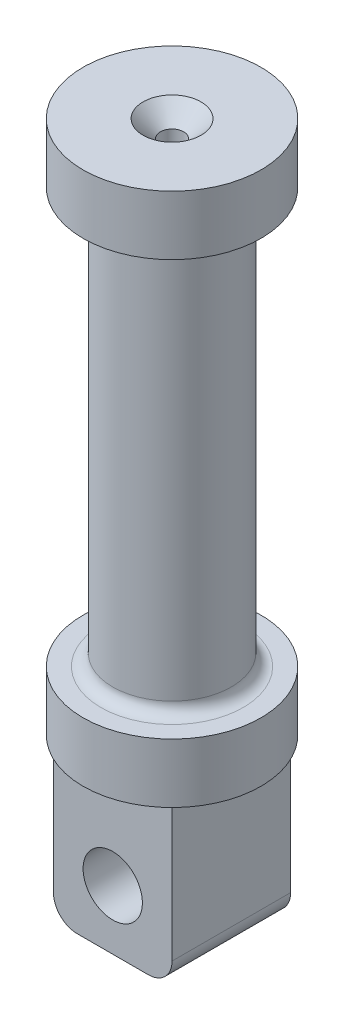
ISO-10303-21;
HEADER;
FILE_DESCRIPTION(('STEP AP214'),'2;1');
FILE_NAME('part.step','',(''),(''),'','','');
FILE_SCHEMA(('AUTOMOTIVE_DESIGN { 1 0 10303 214 1 1 1 1 }'));
ENDSEC;
DATA;
#1=APPLICATION_CONTEXT('core data for automotive mechanical design processes');
#2=APPLICATION_PROTOCOL_DEFINITION('international standard','automotive_design',2000,#1);
#3=PRODUCT_CONTEXT('',#1,'mechanical');
#4=PRODUCT('Part','Part','',(#3));
#5=PRODUCT_RELATED_PRODUCT_CATEGORY('part','',(#4));
#6=PRODUCT_DEFINITION_FORMATION('','',#4);
#7=PRODUCT_DEFINITION_CONTEXT('part definition',#1,'design');
#8=PRODUCT_DEFINITION('design','',#6,#7);
#9=PRODUCT_DEFINITION_SHAPE('','',#8);
#10=(LENGTH_UNIT() NAMED_UNIT(*) SI_UNIT(.MILLI.,.METRE.));
#11=(NAMED_UNIT(*) PLANE_ANGLE_UNIT() SI_UNIT($,.RADIAN.));
#12=(NAMED_UNIT(*) SI_UNIT($,.STERADIAN.) SOLID_ANGLE_UNIT());
#13=UNCERTAINTY_MEASURE_WITH_UNIT(LENGTH_MEASURE(1.E-05),#10,'distance_accuracy_value','');
#14=(GEOMETRIC_REPRESENTATION_CONTEXT(3) GLOBAL_UNCERTAINTY_ASSIGNED_CONTEXT((#13)) GLOBAL_UNIT_ASSIGNED_CONTEXT((#10,
#11,#12)) REPRESENTATION_CONTEXT('',''));
#15=CARTESIAN_POINT('',(0.,0.,0.));
#16=DIRECTION('',(0.,0.,1.));
#17=DIRECTION('',(1.,0.,0.));
#18=AXIS2_PLACEMENT_3D('',#15,#16,#17);
#19=CARTESIAN_POINT('',(1053.1485327014,994.646701933444,1037.31529061443));
#20=DIRECTION('',(-1.,0.,0.));
#21=DIRECTION('',(0.,0.,1.));
#22=AXIS2_PLACEMENT_3D('',#19,#20,#21);
#23=PLANE('',#22);
#24=DIRECTION('',(0.,-1.,0.));
#25=VECTOR('',#24,1.);
#26=CARTESIAN_POINT('',(1053.1485327014,994.646701933444,1050.01529061443));
#27=LINE('',#26,#25);
#28=CARTESIAN_POINT('',(1053.1485327014,994.646701933444,1050.01529061443));
#29=VERTEX_POINT('',#28);
#30=CARTESIAN_POINT('',(1053.1485327014,965.409729673444,1050.01529061443));
#31=VERTEX_POINT('',#30);
#32=EDGE_CURVE('P0_E116',#29,#31,#27,.T.);
#33=ORIENTED_EDGE('',*,*,#32,.T.);
#34=DIRECTION('',(0.,0.,-1.));
#35=VECTOR('',#34,1.);
#36=CARTESIAN_POINT('',(1053.1485327014,965.409729673444,1037.31529061443));
#37=LINE('',#36,#35);
#38=CARTESIAN_POINT('',(1053.1485327014,965.409729673444,1024.61529061443));
#39=VERTEX_POINT('',#38);
#40=EDGE_CURVE('P0_E131',#31,#39,#37,.T.);
#41=ORIENTED_EDGE('',*,*,#40,.T.);
#42=DIRECTION('',(0.,-1.,0.));
#43=VECTOR('',#42,1.);
#44=CARTESIAN_POINT('',(1053.1485327014,994.646701933444,1024.61529061443));
#45=LINE('',#44,#43);
#46=CARTESIAN_POINT('',(1053.1485327014,994.646701933444,1024.61529061443));
#47=VERTEX_POINT('',#46);
#48=EDGE_CURVE('P0_E128',#47,#39,#45,.T.);
#49=ORIENTED_EDGE('',*,*,#48,.F.);
#50=DIRECTION('',(0.,0.,-1.));
#51=VECTOR('',#50,1.);
#52=CARTESIAN_POINT('',(1053.1485327014,994.646701933444,1050.01529061443));
#53=LINE('',#52,#51);
#54=EDGE_CURVE('P0_E103',#29,#47,#53,.T.);
#55=ORIENTED_EDGE('',*,*,#54,.F.);
#56=EDGE_LOOP('',(#33,#41,#49,#55));
#57=FACE_BOUND('',#56,.T.);
#58=ADVANCED_FACE('P0_F16',(#57),#23,.F.);
#59=CARTESIAN_POINT('',(1040.4485327014,994.646701933444,1024.61529061443));
#60=DIRECTION('',(0.,0.,1.));
#61=DIRECTION('',(1.,0.,0.));
#62=AXIS2_PLACEMENT_3D('',#59,#60,#61);
#63=PLANE('',#62);
#64=CARTESIAN_POINT('',(1040.4485327014,973.029729673444,1024.61529061443));
#65=DIRECTION('',(0.,0.,1.));
#66=DIRECTION('',(1.,0.,0.));
#67=AXIS2_PLACEMENT_3D('',#64,#65,#66);
#68=CIRCLE('',#67,6.35);
#69=CARTESIAN_POINT('',(1046.7985327014,973.029729673444,1024.61529061443));
#70=VERTEX_POINT('',#69);
#71=EDGE_CURVE('P0_E86',#70,#70,#68,.T.);
#72=ORIENTED_EDGE('',*,*,#71,.T.);
#73=EDGE_LOOP('',(#72));
#74=FACE_BOUND('',#73,.T.);
#75=ORIENTED_EDGE('',*,*,#48,.T.);
#76=CARTESIAN_POINT('',(1048.0685327014,965.409729673444,1024.61529061443));
#77=DIRECTION('',(0.,0.,1.));
#78=DIRECTION('',(1.,0.,0.));
#79=AXIS2_PLACEMENT_3D('',#76,#77,#78);
#80=CIRCLE('',#79,5.08);
#81=CARTESIAN_POINT('',(1048.0685327014,960.329729673444,1024.61529061443));
#82=VERTEX_POINT('',#81);
#83=EDGE_CURVE('P0_E136',#39,#82,#80,.F.);
#84=ORIENTED_EDGE('',*,*,#83,.T.);
#85=DIRECTION('',(-1.,0.,0.));
#86=VECTOR('',#85,1.);
#87=CARTESIAN_POINT('',(1040.4485327014,960.329729673444,1024.61529061443));
#88=LINE('',#87,#86);
#89=CARTESIAN_POINT('',(1032.8285327014,960.329729673444,1024.61529061443));
#90=VERTEX_POINT('',#89);
#91=EDGE_CURVE('P0_E100',#82,#90,#88,.T.);
#92=ORIENTED_EDGE('',*,*,#91,.T.);
#93=CARTESIAN_POINT('',(1032.8285327014,965.409729673444,1024.61529061443));
#94=DIRECTION('',(0.,0.,1.));
#95=DIRECTION('',(1.,0.,0.));
#96=AXIS2_PLACEMENT_3D('',#93,#94,#95);
#97=CIRCLE('',#96,5.08);
#98=CARTESIAN_POINT('',(1027.7485327014,965.409729673444,1024.61529061443));
#99=VERTEX_POINT('',#98);
#100=EDGE_CURVE('P0_E134',#90,#99,#97,.F.);
#101=ORIENTED_EDGE('',*,*,#100,.T.);
#102=DIRECTION('',(0.,-1.,0.));
#103=VECTOR('',#102,1.);
#104=CARTESIAN_POINT('',(1027.7485327014,994.646701933444,1024.61529061443));
#105=LINE('',#104,#103);
#106=CARTESIAN_POINT('',(1027.7485327014,994.646701933444,1024.61529061443));
#107=VERTEX_POINT('',#106);
#108=EDGE_CURVE('P0_E125',#107,#99,#105,.T.);
#109=ORIENTED_EDGE('',*,*,#108,.F.);
#110=DIRECTION('',(-1.,0.,0.));
#111=VECTOR('',#110,1.);
#112=CARTESIAN_POINT('',(1053.1485327014,994.646701933444,1024.61529061443));
#113=LINE('',#112,#111);
#114=EDGE_CURVE('P0_E106',#47,#107,#113,.T.);
#115=ORIENTED_EDGE('',*,*,#114,.F.);
#116=EDGE_LOOP('',(#75,#84,#92,#101,#109,#115));
#117=FACE_BOUND('',#116,.T.);
#118=ADVANCED_FACE('P0_F161',(#74,#117),#63,.F.);
#119=CARTESIAN_POINT('',(1027.7485327014,994.646701933444,1037.31529061443));
#120=DIRECTION('',(1.,0.,0.));
#121=DIRECTION('',(0.,0.,-1.));
#122=AXIS2_PLACEMENT_3D('',#119,#120,#121);
#123=PLANE('',#122);
#124=ORIENTED_EDGE('',*,*,#108,.T.);
#125=DIRECTION('',(0.,0.,1.));
#126=VECTOR('',#125,1.);
#127=CARTESIAN_POINT('',(1027.7485327014,965.409729673444,1037.31529061443));
#128=LINE('',#127,#126);
#129=CARTESIAN_POINT('',(1027.7485327014,965.409729673444,1050.01529061443));
#130=VERTEX_POINT('',#129);
#131=EDGE_CURVE('P0_E144',#99,#130,#128,.T.);
#132=ORIENTED_EDGE('',*,*,#131,.T.);
#133=DIRECTION('',(0.,-1.,0.));
#134=VECTOR('',#133,1.);
#135=CARTESIAN_POINT('',(1027.7485327014,994.646701933444,1050.01529061443));
#136=LINE('',#135,#134);
#137=CARTESIAN_POINT('',(1027.7485327014,994.646701933444,1050.01529061443));
#138=VERTEX_POINT('',#137);
#139=EDGE_CURVE('P0_E122',#138,#130,#136,.T.);
#140=ORIENTED_EDGE('',*,*,#139,.F.);
#141=DIRECTION('',(0.,0.,1.));
#142=VECTOR('',#141,1.);
#143=CARTESIAN_POINT('',(1027.7485327014,994.646701933444,1024.61529061443));
#144=LINE('',#143,#142);
#145=EDGE_CURVE('P0_E110',#107,#138,#144,.T.);
#146=ORIENTED_EDGE('',*,*,#145,.F.);
#147=EDGE_LOOP('',(#124,#132,#140,#146));
#148=FACE_BOUND('',#147,.T.);
#149=ADVANCED_FACE('P0_F167',(#148),#123,.F.);
#150=CARTESIAN_POINT('',(1040.4485327014,994.646701933444,1050.01529061443));
#151=DIRECTION('',(0.,0.,-1.));
#152=DIRECTION('',(-1.,0.,0.));
#153=AXIS2_PLACEMENT_3D('',#150,#151,#152);
#154=PLANE('',#153);
#155=CARTESIAN_POINT('',(1040.4485327014,973.029729673444,1050.01529061443));
#156=DIRECTION('',(0.,0.,1.));
#157=DIRECTION('',(1.,0.,0.));
#158=AXIS2_PLACEMENT_3D('',#155,#156,#157);
#159=CIRCLE('',#158,6.35);
#160=CARTESIAN_POINT('',(1046.7985327014,973.029729673444,1050.01529061443));
#161=VERTEX_POINT('',#160);
#162=EDGE_CURVE('P0_E82',#161,#161,#159,.T.);
#163=ORIENTED_EDGE('',*,*,#162,.F.);
#164=EDGE_LOOP('',(#163));
#165=FACE_BOUND('',#164,.T.);
#166=DIRECTION('',(1.,0.,0.));
#167=VECTOR('',#166,1.);
#168=CARTESIAN_POINT('',(1040.4485327014,960.329729673444,1050.01529061443));
#169=LINE('',#168,#167);
#170=CARTESIAN_POINT('',(1032.8285327014,960.329729673444,1050.01529061443));
#171=VERTEX_POINT('',#170);
#172=CARTESIAN_POINT('',(1048.0685327014,960.329729673444,1050.01529061443));
#173=VERTEX_POINT('',#172);
#174=EDGE_CURVE('P0_E107',#171,#173,#169,.T.);
#175=ORIENTED_EDGE('',*,*,#174,.T.);
#176=CARTESIAN_POINT('',(1048.0685327014,965.409729673444,1050.01529061443));
#177=DIRECTION('',(0.,0.,-1.));
#178=DIRECTION('',(-1.,0.,0.));
#179=AXIS2_PLACEMENT_3D('',#176,#177,#178);
#180=CIRCLE('',#179,5.08);
#181=EDGE_CURVE('P0_E142',#173,#31,#180,.F.);
#182=ORIENTED_EDGE('',*,*,#181,.T.);
#183=ORIENTED_EDGE('',*,*,#32,.F.);
#184=DIRECTION('',(1.,0.,0.));
#185=VECTOR('',#184,1.);
#186=CARTESIAN_POINT('',(1027.7485327014,994.646701933444,1050.01529061443));
#187=LINE('',#186,#185);
#188=EDGE_CURVE('P0_E113',#138,#29,#187,.T.);
#189=ORIENTED_EDGE('',*,*,#188,.F.);
#190=ORIENTED_EDGE('',*,*,#139,.T.);
#191=CARTESIAN_POINT('',(1032.8285327014,965.409729673444,1050.01529061443));
#192=DIRECTION('',(0.,0.,-1.));
#193=DIRECTION('',(-1.,0.,0.));
#194=AXIS2_PLACEMENT_3D('',#191,#192,#193);
#195=CIRCLE('',#194,5.08);
#196=EDGE_CURVE('P0_E31',#130,#171,#195,.F.);
#197=ORIENTED_EDGE('',*,*,#196,.T.);
#198=EDGE_LOOP('',(#175,#182,#183,#189,#190,#197));
#199=FACE_BOUND('',#198,.T.);
#200=ADVANCED_FACE('P0_F185',(#165,#199),#154,.F.);
#201=CARTESIAN_POINT('',(1040.4485327014,960.329729673444,1037.31529061443));
#202=DIRECTION('',(0.,1.,0.));
#203=DIRECTION('',(0.,0.,1.));
#204=AXIS2_PLACEMENT_3D('',#201,#202,#203);
#205=PLANE('',#204);
#206=ORIENTED_EDGE('',*,*,#91,.F.);
#207=DIRECTION('',(0.,0.,-1.));
#208=VECTOR('',#207,1.);
#209=CARTESIAN_POINT('',(1048.0685327014,960.329729673444,1037.31529061443));
#210=LINE('',#209,#208);
#211=EDGE_CURVE('P0_E39',#82,#173,#210,.F.);
#212=ORIENTED_EDGE('',*,*,#211,.T.);
#213=ORIENTED_EDGE('',*,*,#174,.F.);
#214=DIRECTION('',(0.,0.,1.));
#215=VECTOR('',#214,1.);
#216=CARTESIAN_POINT('',(1032.8285327014,960.329729673444,1037.31529061443));
#217=LINE('',#216,#215);
#218=EDGE_CURVE('P0_E138',#171,#90,#217,.F.);
#219=ORIENTED_EDGE('',*,*,#218,.T.);
#220=EDGE_LOOP('',(#206,#212,#213,#219));
#221=FACE_BOUND('',#220,.T.);
#222=ADVANCED_FACE('P0_F194',(#221),#205,.F.);
#223=CARTESIAN_POINT('',(1040.4485327014,994.646701933444,1037.31529061443));
#224=DIRECTION('',(0.,1.,0.));
#225=DIRECTION('',(0.,0.,1.));
#226=AXIS2_PLACEMENT_3D('',#223,#224,#225);
#227=PLANE('',#226);
#228=CARTESIAN_POINT('',(1040.4485327014,994.646701933444,1037.31529061443));
#229=DIRECTION('',(0.,1.,0.));
#230=DIRECTION('',(0.,0.,1.));
#231=AXIS2_PLACEMENT_3D('',#228,#229,#230);
#232=CIRCLE('',#231,19.05);
#233=CARTESIAN_POINT('',(1040.4485327014,994.646701933444,1056.36529061443));
#234=VERTEX_POINT('',#233);
#235=EDGE_CURVE('P0_E96',#234,#234,#232,.T.);
#236=ORIENTED_EDGE('',*,*,#235,.F.);
#237=EDGE_LOOP('',(#236));
#238=FACE_BOUND('',#237,.T.);
#239=ORIENTED_EDGE('',*,*,#188,.T.);
#240=ORIENTED_EDGE('',*,*,#54,.T.);
#241=ORIENTED_EDGE('',*,*,#114,.T.);
#242=ORIENTED_EDGE('',*,*,#145,.T.);
#243=EDGE_LOOP('',(#239,#240,#241,#242));
#244=FACE_BOUND('',#243,.T.);
#245=ADVANCED_FACE('P0_F189',(#238,#244),#227,.F.);
#246=CARTESIAN_POINT('',(1040.4485327014,1007.34670193344,1037.31529061443));
#247=DIRECTION('',(0.,-1.,0.));
#248=DIRECTION('',(0.,0.,-1.));
#249=AXIS2_PLACEMENT_3D('',#246,#247,#248);
#250=CYLINDRICAL_SURFACE('',#249,19.05);
#251=CARTESIAN_POINT('',(1040.4485327014,1007.34670193344,1037.31529061443));
#252=DIRECTION('',(0.,1.,0.));
#253=DIRECTION('',(0.,0.,1.));
#254=AXIS2_PLACEMENT_3D('',#251,#252,#253);
#255=CIRCLE('',#254,19.05);
#256=CARTESIAN_POINT('',(1040.4485327014,1007.34670193344,1056.36529061443));
#257=VERTEX_POINT('',#256);
#258=EDGE_CURVE('P0_E97',#257,#257,#255,.T.);
#259=ORIENTED_EDGE('',*,*,#258,.F.);
#260=EDGE_LOOP('',(#259));
#261=FACE_BOUND('',#260,.T.);
#262=ORIENTED_EDGE('',*,*,#235,.T.);
#263=EDGE_LOOP('',(#262));
#264=FACE_BOUND('',#263,.T.);
#265=ADVANCED_FACE('P0_F201',(#261,#264),#250,.T.);
#266=CARTESIAN_POINT('',(1040.4485327014,1007.34670193344,1037.31529061443));
#267=DIRECTION('',(0.,1.,0.));
#268=DIRECTION('',(0.,0.,1.));
#269=AXIS2_PLACEMENT_3D('',#266,#267,#268);
#270=PLANE('',#269);
#271=CARTESIAN_POINT('',(1040.4485327014,1007.34670193344,1037.31529061443));
#272=DIRECTION('',(0.,1.,0.));
#273=DIRECTION('',(0.,0.,1.));
#274=AXIS2_PLACEMENT_3D('',#271,#272,#273);
#275=CIRCLE('',#274,15.24);
#276=CARTESIAN_POINT('',(1040.4485327014,1007.34670193344,1052.55529061443));
#277=VERTEX_POINT('',#276);
#278=EDGE_CURVE('P0_E11',#277,#277,#275,.F.);
#279=ORIENTED_EDGE('',*,*,#278,.T.);
#280=EDGE_LOOP('',(#279));
#281=FACE_BOUND('',#280,.T.);
#282=ORIENTED_EDGE('',*,*,#258,.T.);
#283=EDGE_LOOP('',(#282));
#284=FACE_BOUND('',#283,.T.);
#285=ADVANCED_FACE('P0_F243',(#281,#284),#270,.T.);
#286=CARTESIAN_POINT('',(1040.4485327014,1096.24670193344,1037.31529061443));
#287=DIRECTION('',(0.,-1.,0.));
#288=DIRECTION('',(0.,0.,-1.));
#289=AXIS2_PLACEMENT_3D('',#286,#287,#288);
#290=CYLINDRICAL_SURFACE('',#289,12.7);
#291=CARTESIAN_POINT('',(1040.4485327014,1009.88670193344,1037.31529061443));
#292=DIRECTION('',(0.,1.,0.));
#293=DIRECTION('',(0.,0.,1.));
#294=AXIS2_PLACEMENT_3D('',#291,#292,#293);
#295=CIRCLE('',#294,12.7);
#296=CARTESIAN_POINT('',(1040.4485327014,1009.88670193344,1050.01529061443));
#297=VERTEX_POINT('',#296);
#298=EDGE_CURVE('P0_E24',#297,#297,#295,.T.);
#299=ORIENTED_EDGE('',*,*,#298,.T.);
#300=EDGE_LOOP('',(#299));
#301=FACE_BOUND('',#300,.T.);
#302=CARTESIAN_POINT('',(1040.4485327014,1096.24670193344,1037.31529061443));
#303=DIRECTION('',(0.,1.,0.));
#304=DIRECTION('',(0.,0.,1.));
#305=AXIS2_PLACEMENT_3D('',#302,#303,#304);
#306=CIRCLE('',#305,12.7);
#307=CARTESIAN_POINT('',(1040.4485327014,1096.24670193344,1050.01529061443));
#308=VERTEX_POINT('',#307);
#309=EDGE_CURVE('P0_E93',#308,#308,#306,.T.);
#310=ORIENTED_EDGE('',*,*,#309,.F.);
#311=EDGE_LOOP('',(#310));
#312=FACE_BOUND('',#311,.T.);
#313=ADVANCED_FACE('P0_F148',(#301,#312),#290,.T.);
#314=CARTESIAN_POINT('',(1040.4485327014,1096.24670193344,1037.31529061443));
#315=DIRECTION('',(0.,1.,0.));
#316=DIRECTION('',(0.,0.,1.));
#317=AXIS2_PLACEMENT_3D('',#314,#315,#316);
#318=PLANE('',#317);
#319=CARTESIAN_POINT('',(1040.4485327014,1096.24670193344,1037.31529061443));
#320=DIRECTION('',(0.,1.,0.));
#321=DIRECTION('',(0.,0.,1.));
#322=AXIS2_PLACEMENT_3D('',#319,#320,#321);
#323=CIRCLE('',#322,2.49999999999999);
#324=CARTESIAN_POINT('',(1040.4485327014,1096.24670193344,1039.81529061443));
#325=VERTEX_POINT('',#324);
#326=EDGE_CURVE('P0_E83',#325,#325,#323,.T.);
#327=ORIENTED_EDGE('',*,*,#326,.F.);
#328=EDGE_LOOP('',(#327));
#329=FACE_BOUND('',#328,.T.);
#330=ORIENTED_EDGE('',*,*,#309,.T.);
#331=EDGE_LOOP('',(#330));
#332=FACE_BOUND('',#331,.T.);
#333=ADVANCED_FACE('P0_F178',(#329,#332),#318,.T.);
#334=CARTESIAN_POINT('',(1040.4485327014,973.029729673444,1018.26529061443));
#335=DIRECTION('',(0.,0.,1.));
#336=DIRECTION('',(1.,0.,0.));
#337=AXIS2_PLACEMENT_3D('',#334,#335,#336);
#338=CYLINDRICAL_SURFACE('',#337,6.35);
#339=ORIENTED_EDGE('',*,*,#162,.T.);
#340=EDGE_LOOP('',(#339));
#341=FACE_BOUND('',#340,.T.);
#342=ORIENTED_EDGE('',*,*,#71,.F.);
#343=EDGE_LOOP('',(#342));
#344=FACE_BOUND('',#343,.T.);
#345=ADVANCED_FACE('P0_F173',(#341,#344),#338,.F.);
#346=CARTESIAN_POINT('',(1048.0685327014,965.409729673444,1037.31529061443));
#347=DIRECTION('',(0.,0.,-1.));
#348=DIRECTION('',(-1.,0.,0.));
#349=AXIS2_PLACEMENT_3D('',#346,#347,#348);
#350=CYLINDRICAL_SURFACE('',#349,5.08);
#351=ORIENTED_EDGE('',*,*,#181,.F.);
#352=ORIENTED_EDGE('',*,*,#211,.F.);
#353=ORIENTED_EDGE('',*,*,#83,.F.);
#354=ORIENTED_EDGE('',*,*,#40,.F.);
#355=EDGE_LOOP('',(#351,#352,#353,#354));
#356=FACE_BOUND('',#355,.T.);
#357=ADVANCED_FACE('P0_F158',(#356),#350,.T.);
#358=CARTESIAN_POINT('',(1032.8285327014,965.409729673444,1037.31529061443));
#359=DIRECTION('',(0.,0.,1.));
#360=DIRECTION('',(1.,0.,0.));
#361=AXIS2_PLACEMENT_3D('',#358,#359,#360);
#362=CYLINDRICAL_SURFACE('',#361,5.08);
#363=ORIENTED_EDGE('',*,*,#100,.F.);
#364=ORIENTED_EDGE('',*,*,#218,.F.);
#365=ORIENTED_EDGE('',*,*,#196,.F.);
#366=ORIENTED_EDGE('',*,*,#131,.F.);
#367=EDGE_LOOP('',(#363,#364,#365,#366));
#368=FACE_BOUND('',#367,.T.);
#369=ADVANCED_FACE('P0_F152',(#368),#362,.T.);
#370=CARTESIAN_POINT('',(1040.4485327014,1009.88670193344,1037.31529061443));
#371=DIRECTION('',(0.,1.,0.));
#372=DIRECTION('',(0.,0.,1.));
#373=AXIS2_PLACEMENT_3D('',#370,#371,#372);
#374=TOROIDAL_SURFACE('',#373,15.24,2.54);
#375=ORIENTED_EDGE('',*,*,#278,.F.);
#376=EDGE_LOOP('',(#375));
#377=FACE_BOUND('',#376,.T.);
#378=ORIENTED_EDGE('',*,*,#298,.F.);
#379=EDGE_LOOP('',(#378));
#380=FACE_BOUND('',#379,.T.);
#381=ADVANCED_FACE('P0_F18',(#377,#380),#374,.F.);
#382=CARTESIAN_POINT('',(1040.4485327014,1055.09870193344,1037.31529061443));
#383=DIRECTION('',(0.,1.,0.));
#384=DIRECTION('',(0.,0.,1.));
#385=AXIS2_PLACEMENT_3D('',#382,#383,#384);
#386=CONICAL_SURFACE('',#385,2.49999999999999,1.02974425867665);
#387=CARTESIAN_POINT('',(1040.4485327014,1053.59655038587,1037.31529061443));
#388=VERTEX_POINT('',#387);
#389=VERTEX_LOOP('',#388);
#390=FACE_BOUND('',#389,.T.);
#391=CARTESIAN_POINT('',(1040.4485327014,1055.09870193344,1037.31529061443));
#392=DIRECTION('',(0.,1.,0.));
#393=DIRECTION('',(0.,0.,1.));
#394=AXIS2_PLACEMENT_3D('',#391,#392,#393);
#395=CIRCLE('',#394,2.49999999999999);
#396=CARTESIAN_POINT('',(1040.4485327014,1055.09870193344,1039.81529061443));
#397=VERTEX_POINT('',#396);
#398=EDGE_CURVE('P0_E80',#397,#397,#395,.T.);
#399=ORIENTED_EDGE('',*,*,#398,.T.);
#400=EDGE_LOOP('',(#399));
#401=FACE_BOUND('',#400,.T.);
#402=ADVANCED_FACE('P0_F73',(#390,#401),#386,.F.);
#403=CARTESIAN_POINT('',(1040.4485327014,1096.24670193344,1037.31529061443));
#404=DIRECTION('',(0.,1.,0.));
#405=DIRECTION('',(0.,0.,1.));
#406=AXIS2_PLACEMENT_3D('',#403,#404,#405);
#407=CYLINDRICAL_SURFACE('',#406,2.49999999999999);
#408=ORIENTED_EDGE('',*,*,#398,.F.);
#409=EDGE_LOOP('',(#408));
#410=FACE_BOUND('',#409,.T.);
#411=ORIENTED_EDGE('',*,*,#326,.T.);
#412=EDGE_LOOP('',(#411));
#413=FACE_BOUND('',#412,.T.);
#414=ADVANCED_FACE('P0_F76',(#410,#413),#407,.F.);
#415=CLOSED_SHELL('',(#58,#118,#149,#200,#222,#245,#265,#285,#313,#333,#345,#357,#369,#381,#402,#414));
#416=MANIFOLD_SOLID_BREP('P0_B1',#415);
#417=CARTESIAN_POINT('',(1040.4485327014,1108.94670193344,1037.31529061443));
#418=DIRECTION('',(0.,-1.,0.));
#419=DIRECTION('',(0.,0.,-1.));
#420=AXIS2_PLACEMENT_3D('',#417,#418,#419);
#421=CYLINDRICAL_SURFACE('',#420,19.05);
#422=CARTESIAN_POINT('',(1040.4485327014,1108.94670193344,1037.31529061443));
#423=DIRECTION('',(0.,1.,0.));
#424=DIRECTION('',(0.,0.,1.));
#425=AXIS2_PLACEMENT_3D('',#422,#423,#424);
#426=CIRCLE('',#425,19.05);
#427=CARTESIAN_POINT('',(1040.4485327014,1108.94670193344,1056.36529061443));
#428=VERTEX_POINT('',#427);
#429=EDGE_CURVE('P1_E10',#428,#428,#426,.T.);
#430=ORIENTED_EDGE('',*,*,#429,.F.);
#431=EDGE_LOOP('',(#430));
#432=FACE_BOUND('',#431,.T.);
#433=CARTESIAN_POINT('',(1040.4485327014,1096.24670193344,1037.31529061443));
#434=DIRECTION('',(0.,1.,0.));
#435=DIRECTION('',(0.,0.,1.));
#436=AXIS2_PLACEMENT_3D('',#433,#434,#435);
#437=CIRCLE('',#436,19.05);
#438=CARTESIAN_POINT('',(1040.4485327014,1096.24670193344,1056.36529061443));
#439=VERTEX_POINT('',#438);
#440=EDGE_CURVE('P1_E17',#439,#439,#437,.T.);
#441=ORIENTED_EDGE('',*,*,#440,.T.);
#442=EDGE_LOOP('',(#441));
#443=FACE_BOUND('',#442,.T.);
#444=ADVANCED_FACE('P1_F14',(#432,#443),#421,.T.);
#445=CARTESIAN_POINT('',(1040.4485327014,1108.94670193344,1037.31529061443));
#446=DIRECTION('',(0.,1.,0.));
#447=DIRECTION('',(0.,0.,1.));
#448=AXIS2_PLACEMENT_3D('',#445,#446,#447);
#449=PLANE('',#448);
#450=CARTESIAN_POINT('',(1040.4485327014,1108.94670193344,1037.31529061443));
#451=DIRECTION('',(0.,1.,0.));
#452=DIRECTION('',(0.,0.,1.));
#453=AXIS2_PLACEMENT_3D('',#450,#451,#452);
#454=CIRCLE('',#453,6.2);
#455=CARTESIAN_POINT('',(1040.4485327014,1108.94670193344,1043.51529061443));
#456=VERTEX_POINT('',#455);
#457=EDGE_CURVE('P1_E31',#456,#456,#454,.T.);
#458=ORIENTED_EDGE('',*,*,#457,.F.);
#459=EDGE_LOOP('',(#458));
#460=FACE_BOUND('',#459,.T.);
#461=ORIENTED_EDGE('',*,*,#429,.T.);
#462=EDGE_LOOP('',(#461));
#463=FACE_BOUND('',#462,.T.);
#464=ADVANCED_FACE('P1_F37',(#460,#463),#449,.T.);
#465=CARTESIAN_POINT('',(1040.4485327014,1096.24670193344,1037.31529061443));
#466=DIRECTION('',(0.,1.,0.));
#467=DIRECTION('',(0.,0.,1.));
#468=AXIS2_PLACEMENT_3D('',#465,#466,#467);
#469=PLANE('',#468);
#470=CARTESIAN_POINT('',(1040.4485327014,1096.24670193344,1037.31529061443));
#471=DIRECTION('',(0.,1.,0.));
#472=DIRECTION('',(0.,0.,1.));
#473=AXIS2_PLACEMENT_3D('',#470,#471,#472);
#474=CIRCLE('',#473,2.49999999999999);
#475=CARTESIAN_POINT('',(1040.4485327014,1096.24670193344,1039.81529061443));
#476=VERTEX_POINT('',#475);
#477=EDGE_CURVE('P1_E24',#476,#476,#474,.T.);
#478=ORIENTED_EDGE('',*,*,#477,.T.);
#479=EDGE_LOOP('',(#478));
#480=FACE_BOUND('',#479,.T.);
#481=ORIENTED_EDGE('',*,*,#440,.F.);
#482=EDGE_LOOP('',(#481));
#483=FACE_BOUND('',#482,.T.);
#484=ADVANCED_FACE('P1_F39',(#480,#483),#469,.F.);
#485=CARTESIAN_POINT('',(1040.4485327014,1108.94670193344,1037.31529061443));
#486=DIRECTION('',(0.,1.,0.));
#487=DIRECTION('',(0.,0.,1.));
#488=AXIS2_PLACEMENT_3D('',#485,#486,#487);
#489=CYLINDRICAL_SURFACE('',#488,2.49999999999999);
#490=ORIENTED_EDGE('',*,*,#477,.F.);
#491=EDGE_LOOP('',(#490));
#492=FACE_BOUND('',#491,.T.);
#493=CARTESIAN_POINT('',(1040.4485327014,1105.24670193344,1037.31529061443));
#494=DIRECTION('',(0.,1.,0.));
#495=DIRECTION('',(0.,0.,1.));
#496=AXIS2_PLACEMENT_3D('',#493,#494,#495);
#497=CIRCLE('',#496,2.5);
#498=CARTESIAN_POINT('',(1040.4485327014,1105.24670193344,1039.81529061443));
#499=VERTEX_POINT('',#498);
#500=EDGE_CURVE('P1_E28',#499,#499,#497,.T.);
#501=ORIENTED_EDGE('',*,*,#500,.T.);
#502=EDGE_LOOP('',(#501));
#503=FACE_BOUND('',#502,.T.);
#504=ADVANCED_FACE('P1_F46',(#492,#503),#489,.F.);
#505=CARTESIAN_POINT('',(1040.4485327014,1108.94670193344,1037.31529061443));
#506=DIRECTION('',(0.,1.,0.));
#507=DIRECTION('',(0.,0.,1.));
#508=AXIS2_PLACEMENT_3D('',#505,#506,#507);
#509=CONICAL_SURFACE('',#508,6.2,0.785398163397449);
#510=ORIENTED_EDGE('',*,*,#500,.F.);
#511=EDGE_LOOP('',(#510));
#512=FACE_BOUND('',#511,.T.);
#513=ORIENTED_EDGE('',*,*,#457,.T.);
#514=EDGE_LOOP('',(#513));
#515=FACE_BOUND('',#514,.T.);
#516=ADVANCED_FACE('P1_F35',(#512,#515),#509,.F.);
#517=CLOSED_SHELL('',(#444,#464,#484,#504,#516));
#518=MANIFOLD_SOLID_BREP('P1_B1',#517);
#519=ADVANCED_BREP_SHAPE_REPRESENTATION('',(#18,#416,#518),#14);
#520=SHAPE_DEFINITION_REPRESENTATION(#9,#519);
ENDSEC;
END-ISO-10303-21;
